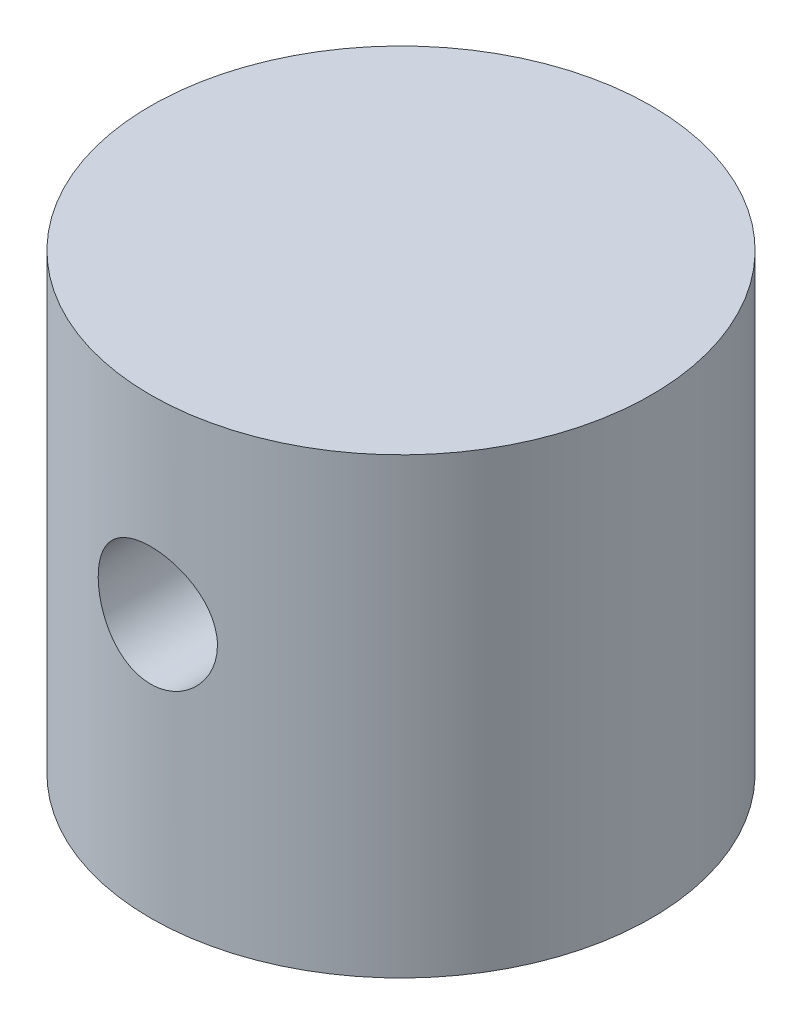
ISO-10303-21;
HEADER;
FILE_DESCRIPTION(('STEP AP214'),'2;1');
FILE_NAME('part.step','',(''),(''),'','','');
FILE_SCHEMA(('AUTOMOTIVE_DESIGN { 1 0 10303 214 1 1 1 1 }'));
ENDSEC;
DATA;
#1=APPLICATION_CONTEXT('core data for automotive mechanical design processes');
#2=APPLICATION_PROTOCOL_DEFINITION('international standard','automotive_design',2000,#1);
#3=PRODUCT_CONTEXT('',#1,'mechanical');
#4=PRODUCT('Part','Part','',(#3));
#5=PRODUCT_RELATED_PRODUCT_CATEGORY('part','',(#4));
#6=PRODUCT_DEFINITION_FORMATION('','',#4);
#7=PRODUCT_DEFINITION_CONTEXT('part definition',#1,'design');
#8=PRODUCT_DEFINITION('design','',#6,#7);
#9=PRODUCT_DEFINITION_SHAPE('','',#8);
#10=(LENGTH_UNIT() NAMED_UNIT(*) SI_UNIT(.MILLI.,.METRE.));
#11=(NAMED_UNIT(*) PLANE_ANGLE_UNIT() SI_UNIT($,.RADIAN.));
#12=(NAMED_UNIT(*) SI_UNIT($,.STERADIAN.) SOLID_ANGLE_UNIT());
#13=UNCERTAINTY_MEASURE_WITH_UNIT(LENGTH_MEASURE(1.E-05),#10,'distance_accuracy_value','');
#14=(GEOMETRIC_REPRESENTATION_CONTEXT(3) GLOBAL_UNCERTAINTY_ASSIGNED_CONTEXT((#13)) GLOBAL_UNIT_ASSIGNED_CONTEXT((#10,
#11,#12)) REPRESENTATION_CONTEXT('',''));
#15=CARTESIAN_POINT('',(0.,0.,0.));
#16=DIRECTION('',(0.,0.,1.));
#17=DIRECTION('',(1.,0.,0.));
#18=AXIS2_PLACEMENT_3D('',#15,#16,#17);
#19=CARTESIAN_POINT('',(0.,19.,0.));
#20=DIRECTION('',(0.,-1.,0.));
#21=DIRECTION('',(0.,0.,-1.));
#22=AXIS2_PLACEMENT_3D('',#19,#20,#21);
#23=CYLINDRICAL_SURFACE('',#22,10.5);
#24=CARTESIAN_POINT('',(0.,13.5,-10.5));
#25=CARTESIAN_POINT('',(-0.138336137279082,13.4999957581925,-10.4999975434588));
#26=CARTESIAN_POINT('',(-0.276721109569138,13.4884791755353,-10.4972387033951));
#27=CARTESIAN_POINT('',(-0.549538850757647,13.4427777132838,-10.4865001085106));
#28=CARTESIAN_POINT('',(-0.68396909432786,13.4085786642176,-10.4785170902483));
#29=CARTESIAN_POINT('',(-0.944897052807474,13.3186610273825,-10.4582160616993));
#30=CARTESIAN_POINT('',(-1.07140361874548,13.2629669672025,-10.4459029937755));
#31=CARTESIAN_POINT('',(-1.31327613755792,13.1317232903751,-10.4182601205493));
#32=CARTESIAN_POINT('',(-1.42864197199632,13.0561734626748,-10.4029302831811));
#33=CARTESIAN_POINT('',(-1.64712984534485,12.8858606651037,-10.3706017150262));
#34=CARTESIAN_POINT('',(-1.75001240826077,12.7907949774152,-10.3535791863802));
#35=CARTESIAN_POINT('',(-1.93853379683689,12.584797843619,-10.3199455954121));
#36=CARTESIAN_POINT('',(-2.02417084604485,12.4738647650299,-10.3033345756337));
#37=CARTESIAN_POINT('',(-2.17686887987817,12.2374575247893,-10.2721670426225));
#38=CARTESIAN_POINT('',(-2.24366710465667,12.1118092841993,-10.2576408584752));
#39=CARTESIAN_POINT('',(-2.35510329990628,11.8506663890944,-10.2326327070929));
#40=CARTESIAN_POINT('',(-2.39974445425968,11.7151731524756,-10.2221501588518));
#41=CARTESIAN_POINT('',(-2.46479239184226,11.4408061114395,-10.2066599201534));
#42=CARTESIAN_POINT('',(-2.48562721809095,11.3020393637561,-10.2015556620545));
#43=CARTESIAN_POINT('',(-2.5038034744538,11.0228935000761,-10.1971105041989));
#44=CARTESIAN_POINT('',(-2.50114835178745,10.8825146236839,-10.1977687587762));
#45=CARTESIAN_POINT('',(-2.47276275553414,10.6073703437897,-10.2046871951112));
#46=CARTESIAN_POINT('',(-2.44753718505243,10.4725492934178,-10.2108247966834));
#47=CARTESIAN_POINT('',(-2.37553000240983,10.2091097394113,-10.2278156410081));
#48=CARTESIAN_POINT('',(-2.32874698257163,10.0804916414285,-10.2386691917041));
#49=CARTESIAN_POINT('',(-2.21450959138648,9.83172931208574,-10.2639847745444));
#50=CARTESIAN_POINT('',(-2.14686769876002,9.71167464106625,-10.2784793105356));
#51=CARTESIAN_POINT('',(-1.99296407487243,9.48443647239877,-10.3094247325612));
#52=CARTESIAN_POINT('',(-1.9066993668615,9.37725503673107,-10.3258759311678));
#53=CARTESIAN_POINT('',(-1.7153607738132,9.17590689823717,-10.3594010879078));
#54=CARTESIAN_POINT('',(-1.60985948183825,9.08214674056528,-10.3764801697085));
#55=CARTESIAN_POINT('',(-1.3844300128221,8.91357674273721,-10.408952960856));
#56=CARTESIAN_POINT('',(-1.264501472065,8.8387673804848,-10.4243466276942));
#57=CARTESIAN_POINT('',(-1.01307505062908,8.71009284171006,-10.4517795741869));
#58=CARTESIAN_POINT('',(-0.881544829738132,8.65628863490344,-10.4638090606989));
#59=CARTESIAN_POINT('',(-0.610957907853852,8.57166404962355,-10.4830865467713));
#60=CARTESIAN_POINT('',(-0.471902513632526,8.54083969427033,-10.4903353736449));
#61=CARTESIAN_POINT('',(-0.193692828601948,8.50365894662848,-10.4991142042131));
#62=CARTESIAN_POINT('',(-0.0546165957888378,8.49674826890647,-10.5007737352137));
#63=CARTESIAN_POINT('',(0.222704057862654,8.50607786924137,-10.4985535541471));
#64=CARTESIAN_POINT('',(0.360948545283291,8.52231626874172,-10.4946742915552));
#65=CARTESIAN_POINT('',(0.630790741549755,8.57702495674395,-10.4818949226634));
#66=CARTESIAN_POINT('',(0.762452297252527,8.61519746009046,-10.4730621053881));
#67=CARTESIAN_POINT('',(1.01749963236655,8.71235445253656,-10.4513679020005));
#68=CARTESIAN_POINT('',(1.14088462227697,8.77134092372828,-10.4385061322285));
#69=CARTESIAN_POINT('',(1.37811619208856,8.90955732615818,-10.409866446553));
#70=CARTESIAN_POINT('',(1.4917729035137,8.9891037259215,-10.3940441187298));
#71=CARTESIAN_POINT('',(1.70432235091455,9.16577272256771,-10.3613160355687));
#72=CARTESIAN_POINT('',(1.80321278453018,9.26289805514863,-10.3444101118625));
#73=CARTESIAN_POINT('',(1.98567065399475,9.47453065263607,-10.3109612771398));
#74=CARTESIAN_POINT('',(2.0688510846241,9.58937466638392,-10.2944346495537));
#75=CARTESIAN_POINT('',(2.21475282460654,9.83172294128977,-10.2640365377705));
#76=CARTESIAN_POINT('',(2.27747504973449,9.95922663542654,-10.2501649347375));
#77=CARTESIAN_POINT('',(2.38022508390675,10.2225791425941,-10.2267935635251));
#78=CARTESIAN_POINT('',(2.42038645459652,10.3583734508443,-10.2172681301925));
#79=CARTESIAN_POINT('',(2.47724487394362,10.6350445241601,-10.2036331095431));
#80=CARTESIAN_POINT('',(2.49394649367997,10.7759202936262,-10.1995224671764));
#81=CARTESIAN_POINT('',(2.50318954108941,11.0548322135741,-10.1972574673118));
#82=CARTESIAN_POINT('',(2.49634741508249,11.1928470445852,-10.1989511308176));
#83=CARTESIAN_POINT('',(2.46009509206175,11.4656950371491,-10.2077555543581));
#84=CARTESIAN_POINT('',(2.43068526979016,11.6005282514951,-10.2148662244421));
#85=CARTESIAN_POINT('',(2.35045423221714,11.8625867352691,-10.2336228462105));
#86=CARTESIAN_POINT('',(2.29973843208311,11.9898459863602,-10.2452464481714));
#87=CARTESIAN_POINT('',(2.17842046384604,12.2341353319737,-10.27172440324));
#88=CARTESIAN_POINT('',(2.10781579881189,12.3511641397047,-10.2865791619473));
#89=CARTESIAN_POINT('',(1.94674761804941,12.5746735109211,-10.3182872131225));
#90=CARTESIAN_POINT('',(1.85585170179885,12.6808369774981,-10.3351796370419));
#91=CARTESIAN_POINT('',(1.65763740981362,12.8766051181482,-10.3688150077968));
#92=CARTESIAN_POINT('',(1.55031518959779,12.9662059049561,-10.3855579186664));
#93=CARTESIAN_POINT('',(1.32022210682979,13.1276945106172,-10.4173269419941));
#94=CARTESIAN_POINT('',(1.19723147883353,13.1992758785613,-10.4323212879319));
#95=CARTESIAN_POINT('',(0.940622423064202,13.3206334937819,-10.4585757917461));
#96=CARTESIAN_POINT('',(0.807012226205199,13.3704264375911,-10.4698388073384));
#97=CARTESIAN_POINT('',(0.561236558719236,13.4388084808049,-10.4855584350762));
#98=CARTESIAN_POINT('',(0.450309308650696,13.4617080738324,-10.4909382999675));
#99=CARTESIAN_POINT('',(0.22626550574761,13.4923050994182,-10.4981599779711));
#100=CARTESIAN_POINT('',(0.113149088362173,13.5000034694958,-10.5000020092754));
#101=CARTESIAN_POINT('',(0.,13.5,-10.5));
#102=B_SPLINE_CURVE_WITH_KNOTS('',3,(#24,#25,#26,#27,#28,#29,#30,#31,#32,#33,#34,#35,#36,#37,
#38,#39,#40,#41,#42,#43,#44,#45,#46,#47,#48,#49,#50,#51,#52,#53,#54,#55,#56,#57,#58,#59,#60,#61,
#62,#63,#64,#65,#66,#67,#68,#69,#70,#71,#72,#73,#74,#75,#76,#77,#78,#79,#80,#81,#82,#83,#84,#85,
#86,#87,#88,#89,#90,#91,#92,#93,#94,#95,#96,#97,#98,#99,#100,#101),.UNSPECIFIED.,.T.,.F.,(4,2,2,
2,2,2,2,2,2,2,2,2,2,2,2,2,2,2,2,2,2,2,2,2,2,2,2,2,2,2,2,2,2,2,2,2,2,2,4),(0.,0.414593955930678,
0.829447148107668,1.24382835136143,1.65821395937717,2.07959257414167,2.50101457274044,
2.92805259420199,3.3550292342317,3.77420157375972,4.1933123995274,4.60327579077322,
5.01326595596385,5.42705503347366,5.84091030182319,6.26543010829714,6.68996061930459,
7.11571437325671,7.54139442939284,7.9571392070003,8.37285024867883,8.78304648285508,
9.19328179013112,9.61025259265382,10.0272883415858,10.4535420182195,10.8797766117527,
11.3034605352545,11.7270618934519,12.1396574070664,12.5522460695774,12.9628169794916,
13.373439457181,13.7938286071533,14.2143162976454,14.6415339491407,15.0684236467355,
15.4075528325544,15.7466611022857),.UNSPECIFIED.);
#103=CARTESIAN_POINT('',(0.,13.5,-10.5));
#104=VERTEX_POINT('',#103);
#105=EDGE_CURVE('E117',#104,#104,#102,.T.);
#106=ORIENTED_EDGE('',*,*,#105,.T.);
#107=EDGE_LOOP('',(#106));
#108=FACE_BOUND('',#107,.T.);
#109=CARTESIAN_POINT('',(2.5,11.,10.1980390271856));
#110=CARTESIAN_POINT('',(2.49999571771621,10.8617265266356,10.1980417662799));
#111=CARTESIAN_POINT('',(2.48848921004997,10.7234041266083,10.2008819480951));
#112=CARTESIAN_POINT('',(2.44283138746475,10.4507162264723,10.2119100495576));
#113=CARTESIAN_POINT('',(2.40866564106248,10.3163533051197,10.220101377256));
#114=CARTESIAN_POINT('',(2.31884533433252,10.055568070459,10.2408526576227));
#115=CARTESIAN_POINT('',(2.26321685793814,9.92913633428162,10.2534073056611));
#116=CARTESIAN_POINT('',(2.13212786900036,9.6873904161032,10.2814641264546));
#117=CARTESIAN_POINT('',(2.05666700133913,9.57207643322669,10.2969663519875));
#118=CARTESIAN_POINT('',(1.88644621865885,9.35353514341651,10.3295180748048));
#119=CARTESIAN_POINT('',(1.79136356790472,9.25056256471987,10.3465903884589));
#120=CARTESIAN_POINT('',(1.5852940689898,9.06186598464005,10.3801600371474));
#121=CARTESIAN_POINT('',(1.47430583848449,8.97614348400937,10.3966573220513));
#122=CARTESIAN_POINT('',(1.23784521107821,8.82335182577336,10.4274690302773));
#123=CARTESIAN_POINT('',(1.11220818954147,8.75653085494883,10.4417533871947));
#124=CARTESIAN_POINT('',(0.851089407039723,8.6450495742447,10.4662704926092));
#125=CARTESIAN_POINT('',(0.715608962664383,8.60038630693333,10.4765037817733));
#126=CARTESIAN_POINT('',(0.44130215233432,8.53529836938972,10.4916044652571));
#127=CARTESIAN_POINT('',(0.302583647149309,8.51444167174176,10.4965673832561));
#128=CARTESIAN_POINT('',(0.0235338053366273,8.49620492239017,10.5009002595401));
#129=CARTESIAN_POINT('',(-0.116797311620905,8.49882171011448,10.5002709707842));
#130=CARTESIAN_POINT('',(-0.39209972310052,8.52714255285135,10.4935621966644));
#131=CARTESIAN_POINT('',(-0.52712204313907,8.55238054861658,10.4875927382963));
#132=CARTESIAN_POINT('',(-0.790957522089008,8.62448081973772,10.4710013525068));
#133=CARTESIAN_POINT('',(-0.919770368291498,8.67134418289254,10.4603791910467));
#134=CARTESIAN_POINT('',(-1.16878421413461,8.78575574021175,10.4355041622277));
#135=CARTESIAN_POINT('',(-1.28890397251028,8.85347403438116,10.4212216064534));
#136=CARTESIAN_POINT('',(-1.51624078669456,9.00754506665895,10.3905818447092));
#137=CARTESIAN_POINT('',(-1.6234557826605,9.09390077352068,10.374224308387));
#138=CARTESIAN_POINT('',(-1.82471663379566,9.28530950179743,10.3407488740336));
#139=CARTESIAN_POINT('',(-1.91837375712402,9.39077013097474,10.3236221697636));
#140=CARTESIAN_POINT('',(-2.08675450345623,9.61607975312486,10.2909102679344));
#141=CARTESIAN_POINT('',(-2.1614774018346,9.73592929651243,10.2753251293859));
#142=CARTESIAN_POINT('',(-2.2900867389068,9.98732368488547,10.2474324080862));
#143=CARTESIAN_POINT('',(-2.34388762597933,10.1189138991571,10.2351383452793));
#144=CARTESIAN_POINT('',(-2.42848774223003,10.3896326659971,10.2153979164771));
#145=CARTESIAN_POINT('',(-2.45929138004507,10.5287597682354,10.2079506213779));
#146=CARTESIAN_POINT('',(-2.49639439645703,10.8070188445266,10.19893984574));
#147=CARTESIAN_POINT('',(-2.50326507643121,10.9460702907764,10.197239217194));
#148=CARTESIAN_POINT('',(-2.49386437791222,11.2233322388259,10.199542325466));
#149=CARTESIAN_POINT('',(-2.47759491184765,11.3615428091723,10.2035455908828));
#150=CARTESIAN_POINT('',(-2.42287468523351,11.6311311558133,10.2166747399209));
#151=CARTESIAN_POINT('',(-2.38474937481524,11.7625789987708,10.2257254112251));
#152=CARTESIAN_POINT('',(-2.28775715738406,12.0172195032297,10.2478595881532));
#153=CARTESIAN_POINT('',(-2.22888797351604,12.1404112567725,10.2609435364514));
#154=CARTESIAN_POINT('',(-2.09085863357308,12.3774837467531,10.2899637467827));
#155=CARTESIAN_POINT('',(-2.01135280635273,12.4911573433626,10.3059470466895));
#156=CARTESIAN_POINT('',(-1.8347500858427,12.7037593291372,10.3388463052029));
#157=CARTESIAN_POINT('',(-1.73765058232791,12.8026855263805,10.3557624019413));
#158=CARTESIAN_POINT('',(-1.52600920776177,12.9852603815429,10.3890810399881));
#159=CARTESIAN_POINT('',(-1.41112459577114,13.0685160516528,10.4054635166664));
#160=CARTESIAN_POINT('',(-1.1686711817517,13.2145498767078,10.4354734525102));
#161=CARTESIAN_POINT('',(-1.04110302110991,13.2773290664297,10.4491010508798));
#162=CARTESIAN_POINT('',(-0.777759722096258,13.3801100760749,10.4719825592833));
#163=CARTESIAN_POINT('',(-0.642048766362475,13.4202693189511,10.4812666193847));
#164=CARTESIAN_POINT('',(-0.365556678436385,13.4771515604838,10.4945463869459));
#165=CARTESIAN_POINT('',(-0.224776432575978,13.4938786358879,10.4985430143108));
#166=CARTESIAN_POINT('',(0.0541512863455571,13.503210406814,10.5007640857532));
#167=CARTESIAN_POINT('',(0.192278471246814,13.4963976286758,10.4991279246782));
#168=CARTESIAN_POINT('',(0.465359154899662,13.4601649657765,10.4905722340482));
#169=CARTESIAN_POINT('',(0.600312732382117,13.4307456424496,10.4836528357027));
#170=CARTESIAN_POINT('',(0.862668081323065,13.3504349099437,10.4653253573833));
#171=CARTESIAN_POINT('',(0.990100880575023,13.2996399582357,10.4539374569212));
#172=CARTESIAN_POINT('',(1.23470533202502,13.1781091769553,10.4278784920113));
#173=CARTESIAN_POINT('',(1.35187579903587,13.1073710481335,10.413207049044));
#174=CARTESIAN_POINT('',(1.57542398206671,12.9461366936258,10.3817664472831));
#175=CARTESIAN_POINT('',(1.68150692589577,12.8552393790311,10.3649581831981));
#176=CARTESIAN_POINT('',(1.87711202127358,12.6570577596617,10.3313272613068));
#177=CARTESIAN_POINT('',(1.9666300606383,12.5497693978978,10.3145046009652));
#178=CARTESIAN_POINT('',(2.12800456564131,12.3197205524254,10.2824361838365));
#179=CARTESIAN_POINT('',(2.19954527971807,12.1967340086185,10.2672210222363));
#180=CARTESIAN_POINT('',(2.32082794219708,11.9401389345939,10.2404903539045));
#181=CARTESIAN_POINT('',(2.37058679567045,11.8065387372058,10.2289719799267));
#182=CARTESIAN_POINT('',(2.43889389955241,11.5608474745906,10.2128715845903));
#183=CARTESIAN_POINT('',(2.4617611938327,11.4499988297501,10.2073492174717));
#184=CARTESIAN_POINT('',(2.49231547049874,11.226110927746,10.1999319441581));
#185=CARTESIAN_POINT('',(2.50000350179699,11.1130718224921,10.1980367873171));
#186=CARTESIAN_POINT('',(2.5,11.,10.1980390271856));
#187=B_SPLINE_CURVE_WITH_KNOTS('',3,(#109,#110,#111,#112,#113,#114,#115,#116,#117,#118,#119,
#120,#121,#122,#123,#124,#125,#126,#127,#128,#129,#130,#131,#132,#133,#134,#135,#136,#137,#138,
#139,#140,#141,#142,#143,#144,#145,#146,#147,#148,#149,#150,#151,#152,#153,#154,#155,#156,#157,
#158,#159,#160,#161,#162,#163,#164,#165,#166,#167,#168,#169,#170,#171,#172,#173,#174,#175,#176,
#177,#178,#179,#180,#181,#182,#183,#184,#185,#186),.UNSPECIFIED.,.T.,.F.,(4,2,2,2,2,2,2,2,2,2,2,
2,2,2,2,2,2,2,2,2,2,2,2,2,2,2,2,2,2,2,2,2,2,2,2,2,2,2,4),(0.,0.414405530369434,
0.829075246003818,1.24324258756564,1.65741734569275,2.07904230944008,2.50070393861085,
2.92766929281861,3.35457764378792,3.77360899166427,4.1925839201863,4.60312032758379,
5.01367738802871,5.42767599099182,5.84174058852629,6.26598867755214,6.69025300038529,
7.11623437320497,7.54213406322266,7.95779473486284,8.37342105602115,8.78301344369068,
9.1926508023809,9.60965052687986,10.0267121688371,10.4531399747409,10.8795462278208,
11.3029470417974,11.7262741830055,12.1392013146111,12.5521181914893,12.9631914306563,
13.3743120818603,13.7944933954115,14.2147788780904,14.6419983436025,15.0688856503609,
15.4077852650483,15.7466614603846),.UNSPECIFIED.);
#188=CARTESIAN_POINT('',(2.5,11.,10.1980390271856));
#189=VERTEX_POINT('',#188);
#190=EDGE_CURVE('E161',#189,#189,#187,.T.);
#191=ORIENTED_EDGE('',*,*,#190,.T.);
#192=EDGE_LOOP('',(#191));
#193=FACE_BOUND('',#192,.T.);
#194=CARTESIAN_POINT('',(0.,19.,0.));
#195=DIRECTION('',(0.,1.,0.));
#196=DIRECTION('',(0.,0.,1.));
#197=AXIS2_PLACEMENT_3D('',#194,#195,#196);
#198=CIRCLE('',#197,10.5);
#199=CARTESIAN_POINT('',(0.,19.,10.5));
#200=VERTEX_POINT('',#199);
#201=EDGE_CURVE('E11',#200,#200,#198,.T.);
#202=ORIENTED_EDGE('',*,*,#201,.F.);
#203=EDGE_LOOP('',(#202));
#204=FACE_BOUND('',#203,.T.);
#205=CARTESIAN_POINT('',(0.,0.,0.));
#206=DIRECTION('',(0.,1.,0.));
#207=DIRECTION('',(0.,0.,1.));
#208=AXIS2_PLACEMENT_3D('',#205,#206,#207);
#209=CIRCLE('',#208,10.5);
#210=CARTESIAN_POINT('',(0.,0.,10.5));
#211=VERTEX_POINT('',#210);
#212=EDGE_CURVE('E52',#211,#211,#209,.T.);
#213=ORIENTED_EDGE('',*,*,#212,.T.);
#214=EDGE_LOOP('',(#213));
#215=FACE_BOUND('',#214,.T.);
#216=ADVANCED_FACE('F43',(#108,#193,#204,#215),#23,.T.);
#217=CARTESIAN_POINT('',(0.,19.,0.));
#218=DIRECTION('',(0.,1.,0.));
#219=DIRECTION('',(0.,0.,1.));
#220=AXIS2_PLACEMENT_3D('',#217,#218,#219);
#221=PLANE('',#220);
#222=ORIENTED_EDGE('',*,*,#201,.T.);
#223=EDGE_LOOP('',(#222));
#224=FACE_BOUND('',#223,.T.);
#225=ADVANCED_FACE('F137',(#224),#221,.T.);
#226=CARTESIAN_POINT('',(0.,0.,0.));
#227=DIRECTION('',(0.,1.,0.));
#228=DIRECTION('',(0.,0.,1.));
#229=AXIS2_PLACEMENT_3D('',#226,#227,#228);
#230=PLANE('',#229);
#231=CARTESIAN_POINT('',(0.,0.,0.));
#232=DIRECTION('',(0.,-1.,0.));
#233=DIRECTION('',(0.,0.,-1.));
#234=AXIS2_PLACEMENT_3D('',#231,#232,#233);
#235=CIRCLE('',#234,10.);
#236=CARTESIAN_POINT('',(0.,0.,-10.));
#237=VERTEX_POINT('',#236);
#238=EDGE_CURVE('E123',#237,#237,#235,.T.);
#239=ORIENTED_EDGE('',*,*,#238,.F.);
#240=EDGE_LOOP('',(#239));
#241=FACE_BOUND('',#240,.T.);
#242=ORIENTED_EDGE('',*,*,#212,.F.);
#243=EDGE_LOOP('',(#242));
#244=FACE_BOUND('',#243,.T.);
#245=ADVANCED_FACE('F134',(#241,#244),#230,.F.);
#246=CARTESIAN_POINT('',(0.,6.,0.));
#247=DIRECTION('',(0.,-1.,0.));
#248=DIRECTION('',(0.,0.,-1.));
#249=AXIS2_PLACEMENT_3D('',#246,#247,#248);
#250=CYLINDRICAL_SURFACE('',#249,10.);
#251=CARTESIAN_POINT('',(0.,6.,0.));
#252=DIRECTION('',(0.,-1.,0.));
#253=DIRECTION('',(0.,0.,-1.));
#254=AXIS2_PLACEMENT_3D('',#251,#252,#253);
#255=CIRCLE('',#254,10.);
#256=CARTESIAN_POINT('',(0.,6.,-10.));
#257=VERTEX_POINT('',#256);
#258=EDGE_CURVE('E126',#257,#257,#255,.T.);
#259=ORIENTED_EDGE('',*,*,#258,.F.);
#260=EDGE_LOOP('',(#259));
#261=FACE_BOUND('',#260,.T.);
#262=ORIENTED_EDGE('',*,*,#238,.T.);
#263=EDGE_LOOP('',(#262));
#264=FACE_BOUND('',#263,.T.);
#265=ADVANCED_FACE('F136',(#261,#264),#250,.F.);
#266=CARTESIAN_POINT('',(0.,6.,0.));
#267=DIRECTION('',(0.,-1.,0.));
#268=DIRECTION('',(0.,0.,-1.));
#269=AXIS2_PLACEMENT_3D('',#266,#267,#268);
#270=PLANE('',#269);
#271=CARTESIAN_POINT('',(3.,6.,0.));
#272=DIRECTION('',(0.,-1.,0.));
#273=DIRECTION('',(0.,0.,-1.));
#274=AXIS2_PLACEMENT_3D('',#271,#272,#273);
#275=CIRCLE('',#274,6.);
#276=CARTESIAN_POINT('',(3.,6.,-6.));
#277=VERTEX_POINT('',#276);
#278=CARTESIAN_POINT('',(3.,6.,6.));
#279=VERTEX_POINT('',#278);
#280=EDGE_CURVE('E60',#277,#279,#275,.T.);
#281=ORIENTED_EDGE('',*,*,#280,.F.);
#282=DIRECTION('',(1.,0.,0.));
#283=VECTOR('',#282,1.);
#284=CARTESIAN_POINT('',(3.,6.,-6.));
#285=LINE('',#284,#283);
#286=CARTESIAN_POINT('',(-3.,6.,-6.));
#287=VERTEX_POINT('',#286);
#288=EDGE_CURVE('E111',#287,#277,#285,.T.);
#289=ORIENTED_EDGE('',*,*,#288,.F.);
#290=CARTESIAN_POINT('',(-3.,6.,0.));
#291=DIRECTION('',(0.,-1.,0.));
#292=DIRECTION('',(0.,0.,-1.));
#293=AXIS2_PLACEMENT_3D('',#290,#291,#292);
#294=CIRCLE('',#293,6.);
#295=CARTESIAN_POINT('',(-3.,6.,6.));
#296=VERTEX_POINT('',#295);
#297=EDGE_CURVE('E119',#296,#287,#294,.T.);
#298=ORIENTED_EDGE('',*,*,#297,.F.);
#299=DIRECTION('',(-1.,0.,0.));
#300=VECTOR('',#299,1.);
#301=CARTESIAN_POINT('',(3.,6.,6.));
#302=LINE('',#301,#300);
#303=EDGE_CURVE('E95',#279,#296,#302,.T.);
#304=ORIENTED_EDGE('',*,*,#303,.F.);
#305=EDGE_LOOP('',(#281,#289,#298,#304));
#306=FACE_BOUND('',#305,.T.);
#307=ORIENTED_EDGE('',*,*,#258,.T.);
#308=EDGE_LOOP('',(#307));
#309=FACE_BOUND('',#308,.T.);
#310=ADVANCED_FACE('F143',(#306,#309),#270,.T.);
#311=CARTESIAN_POINT('',(3.,17.,0.));
#312=DIRECTION('',(0.,-1.,0.));
#313=DIRECTION('',(0.,0.,-1.));
#314=AXIS2_PLACEMENT_3D('',#311,#312,#313);
#315=CYLINDRICAL_SURFACE('',#314,6.);
#316=ORIENTED_EDGE('',*,*,#280,.T.);
#317=DIRECTION('',(0.,-1.,0.));
#318=VECTOR('',#317,1.);
#319=CARTESIAN_POINT('',(3.,17.,6.));
#320=LINE('',#319,#318);
#321=CARTESIAN_POINT('',(3.,17.,6.));
#322=VERTEX_POINT('',#321);
#323=EDGE_CURVE('E83',#322,#279,#320,.T.);
#324=ORIENTED_EDGE('',*,*,#323,.F.);
#325=CARTESIAN_POINT('',(3.,17.,0.));
#326=DIRECTION('',(0.,-1.,0.));
#327=DIRECTION('',(0.,0.,-1.));
#328=AXIS2_PLACEMENT_3D('',#325,#326,#327);
#329=CIRCLE('',#328,6.);
#330=CARTESIAN_POINT('',(3.,17.,-6.));
#331=VERTEX_POINT('',#330);
#332=EDGE_CURVE('E109',#331,#322,#329,.T.);
#333=ORIENTED_EDGE('',*,*,#332,.F.);
#334=DIRECTION('',(0.,-1.,0.));
#335=VECTOR('',#334,1.);
#336=CARTESIAN_POINT('',(3.,17.,-6.));
#337=LINE('',#336,#335);
#338=EDGE_CURVE('E68',#331,#277,#337,.T.);
#339=ORIENTED_EDGE('',*,*,#338,.T.);
#340=EDGE_LOOP('',(#316,#324,#333,#339));
#341=FACE_BOUND('',#340,.T.);
#342=ADVANCED_FACE('F185',(#341),#315,.F.);
#343=CARTESIAN_POINT('',(3.,17.,-6.));
#344=DIRECTION('',(0.,0.,-1.));
#345=DIRECTION('',(-1.,0.,0.));
#346=AXIS2_PLACEMENT_3D('',#343,#344,#345);
#347=PLANE('',#346);
#348=CARTESIAN_POINT('',(0.,11.,-6.));
#349=DIRECTION('',(0.,0.,-1.));
#350=DIRECTION('',(-1.,0.,0.));
#351=AXIS2_PLACEMENT_3D('',#348,#349,#350);
#352=CIRCLE('',#351,2.5);
#353=CARTESIAN_POINT('',(-2.5,11.,-6.));
#354=VERTEX_POINT('',#353);
#355=EDGE_CURVE('E164',#354,#354,#352,.T.);
#356=ORIENTED_EDGE('',*,*,#355,.T.);
#357=EDGE_LOOP('',(#356));
#358=FACE_BOUND('',#357,.T.);
#359=ORIENTED_EDGE('',*,*,#288,.T.);
#360=ORIENTED_EDGE('',*,*,#338,.F.);
#361=DIRECTION('',(1.,0.,0.));
#362=VECTOR('',#361,1.);
#363=CARTESIAN_POINT('',(3.,17.,-6.));
#364=LINE('',#363,#362);
#365=CARTESIAN_POINT('',(-3.,17.,-6.));
#366=VERTEX_POINT('',#365);
#367=EDGE_CURVE('E106',#366,#331,#364,.T.);
#368=ORIENTED_EDGE('',*,*,#367,.F.);
#369=DIRECTION('',(0.,-1.,0.));
#370=VECTOR('',#369,1.);
#371=CARTESIAN_POINT('',(-3.,17.,-6.));
#372=LINE('',#371,#370);
#373=EDGE_CURVE('E99',#366,#287,#372,.T.);
#374=ORIENTED_EDGE('',*,*,#373,.T.);
#375=EDGE_LOOP('',(#359,#360,#368,#374));
#376=FACE_BOUND('',#375,.T.);
#377=ADVANCED_FACE('F183',(#358,#376),#347,.F.);
#378=CARTESIAN_POINT('',(-3.,17.,0.));
#379=DIRECTION('',(0.,-1.,0.));
#380=DIRECTION('',(0.,0.,-1.));
#381=AXIS2_PLACEMENT_3D('',#378,#379,#380);
#382=CYLINDRICAL_SURFACE('',#381,6.);
#383=ORIENTED_EDGE('',*,*,#297,.T.);
#384=ORIENTED_EDGE('',*,*,#373,.F.);
#385=CARTESIAN_POINT('',(-3.,17.,0.));
#386=DIRECTION('',(0.,-1.,0.));
#387=DIRECTION('',(0.,0.,-1.));
#388=AXIS2_PLACEMENT_3D('',#385,#386,#387);
#389=CIRCLE('',#388,6.);
#390=CARTESIAN_POINT('',(-3.,17.,6.));
#391=VERTEX_POINT('',#390);
#392=EDGE_CURVE('E102',#391,#366,#389,.T.);
#393=ORIENTED_EDGE('',*,*,#392,.F.);
#394=DIRECTION('',(0.,-1.,0.));
#395=VECTOR('',#394,1.);
#396=CARTESIAN_POINT('',(-3.,17.,6.));
#397=LINE('',#396,#395);
#398=EDGE_CURVE('E88',#391,#296,#397,.T.);
#399=ORIENTED_EDGE('',*,*,#398,.T.);
#400=EDGE_LOOP('',(#383,#384,#393,#399));
#401=FACE_BOUND('',#400,.T.);
#402=ADVANCED_FACE('F103',(#401),#382,.F.);
#403=CARTESIAN_POINT('',(3.,17.,6.));
#404=DIRECTION('',(0.,0.,1.));
#405=DIRECTION('',(1.,0.,0.));
#406=AXIS2_PLACEMENT_3D('',#403,#404,#405);
#407=PLANE('',#406);
#408=CARTESIAN_POINT('',(0.,11.,6.));
#409=DIRECTION('',(0.,0.,1.));
#410=DIRECTION('',(1.,0.,0.));
#411=AXIS2_PLACEMENT_3D('',#408,#409,#410);
#412=CIRCLE('',#411,2.5);
#413=CARTESIAN_POINT('',(2.5,11.,6.));
#414=VERTEX_POINT('',#413);
#415=EDGE_CURVE('E47',#414,#414,#412,.T.);
#416=ORIENTED_EDGE('',*,*,#415,.T.);
#417=EDGE_LOOP('',(#416));
#418=FACE_BOUND('',#417,.T.);
#419=ORIENTED_EDGE('',*,*,#303,.T.);
#420=ORIENTED_EDGE('',*,*,#398,.F.);
#421=DIRECTION('',(-1.,0.,0.));
#422=VECTOR('',#421,1.);
#423=CARTESIAN_POINT('',(3.,17.,6.));
#424=LINE('',#423,#422);
#425=EDGE_CURVE('E92',#322,#391,#424,.T.);
#426=ORIENTED_EDGE('',*,*,#425,.F.);
#427=ORIENTED_EDGE('',*,*,#323,.T.);
#428=EDGE_LOOP('',(#419,#420,#426,#427));
#429=FACE_BOUND('',#428,.T.);
#430=ADVANCED_FACE('F90',(#418,#429),#407,.F.);
#431=CARTESIAN_POINT('',(3.,17.,0.));
#432=DIRECTION('',(0.,-1.,0.));
#433=DIRECTION('',(0.,0.,-1.));
#434=AXIS2_PLACEMENT_3D('',#431,#432,#433);
#435=PLANE('',#434);
#436=ORIENTED_EDGE('',*,*,#332,.T.);
#437=ORIENTED_EDGE('',*,*,#425,.T.);
#438=ORIENTED_EDGE('',*,*,#392,.T.);
#439=ORIENTED_EDGE('',*,*,#367,.T.);
#440=EDGE_LOOP('',(#436,#437,#438,#439));
#441=FACE_BOUND('',#440,.T.);
#442=ADVANCED_FACE('F108',(#441),#435,.T.);
#443=CARTESIAN_POINT('',(0.,11.,-10.5));
#444=DIRECTION('',(0.,0.,1.));
#445=DIRECTION('',(1.,0.,0.));
#446=AXIS2_PLACEMENT_3D('',#443,#444,#445);
#447=CYLINDRICAL_SURFACE('',#446,2.5);
#448=ORIENTED_EDGE('',*,*,#415,.F.);
#449=EDGE_LOOP('',(#448));
#450=FACE_BOUND('',#449,.T.);
#451=ORIENTED_EDGE('',*,*,#190,.F.);
#452=EDGE_LOOP('',(#451));
#453=FACE_BOUND('',#452,.T.);
#454=ADVANCED_FACE('F179',(#450,#453),#447,.F.);
#455=ORIENTED_EDGE('',*,*,#355,.F.);
#456=EDGE_LOOP('',(#455));
#457=FACE_BOUND('',#456,.T.);
#458=ORIENTED_EDGE('',*,*,#105,.F.);
#459=EDGE_LOOP('',(#458));
#460=FACE_BOUND('',#459,.T.);
#461=ADVANCED_FACE('F175',(#457,#460),#447,.F.);
#462=CLOSED_SHELL('',(#216,#225,#245,#265,#310,#342,#377,#402,#430,#442,#454,#461));
#463=MANIFOLD_SOLID_BREP('B2',#462);
#464=ADVANCED_BREP_SHAPE_REPRESENTATION('',(#18,#463),#14);
#465=SHAPE_DEFINITION_REPRESENTATION(#9,#464);
ENDSEC;
END-ISO-10303-21;
